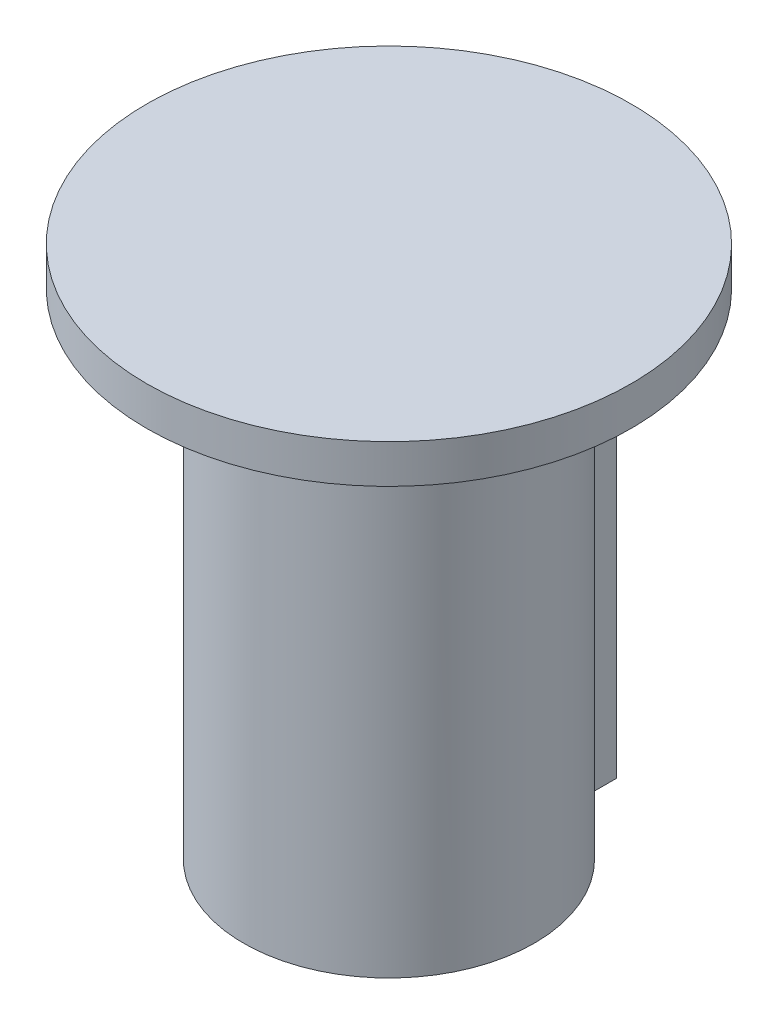
ISO-10303-21;
HEADER;
FILE_DESCRIPTION(('STEP AP214'),'2;1');
FILE_NAME('part.step','',(''),(''),'','','');
FILE_SCHEMA(('AUTOMOTIVE_DESIGN { 1 0 10303 214 1 1 1 1 }'));
ENDSEC;
DATA;
#1=APPLICATION_CONTEXT('core data for automotive mechanical design processes');
#2=APPLICATION_PROTOCOL_DEFINITION('international standard','automotive_design',2000,#1);
#3=PRODUCT_CONTEXT('',#1,'mechanical');
#4=PRODUCT('Part','Part','',(#3));
#5=PRODUCT_RELATED_PRODUCT_CATEGORY('part','',(#4));
#6=PRODUCT_DEFINITION_FORMATION('','',#4);
#7=PRODUCT_DEFINITION_CONTEXT('part definition',#1,'design');
#8=PRODUCT_DEFINITION('design','',#6,#7);
#9=PRODUCT_DEFINITION_SHAPE('','',#8);
#10=(LENGTH_UNIT() NAMED_UNIT(*) SI_UNIT(.MILLI.,.METRE.));
#11=(NAMED_UNIT(*) PLANE_ANGLE_UNIT() SI_UNIT($,.RADIAN.));
#12=(NAMED_UNIT(*) SI_UNIT($,.STERADIAN.) SOLID_ANGLE_UNIT());
#13=UNCERTAINTY_MEASURE_WITH_UNIT(LENGTH_MEASURE(1.E-05),#10,'distance_accuracy_value','');
#14=(GEOMETRIC_REPRESENTATION_CONTEXT(3) GLOBAL_UNCERTAINTY_ASSIGNED_CONTEXT((#13)) GLOBAL_UNIT_ASSIGNED_CONTEXT((#10,
#11,#12)) REPRESENTATION_CONTEXT('',''));
#15=CARTESIAN_POINT('',(0.,0.,0.));
#16=DIRECTION('',(0.,0.,1.));
#17=DIRECTION('',(1.,0.,0.));
#18=AXIS2_PLACEMENT_3D('',#15,#16,#17);
#19=CARTESIAN_POINT('',(0.,11.,0.));
#20=DIRECTION('',(0.,-1.,0.));
#21=DIRECTION('',(0.,0.,-1.));
#22=AXIS2_PLACEMENT_3D('',#19,#20,#21);
#23=CYLINDRICAL_SURFACE('',#22,3.);
#24=CARTESIAN_POINT('',(0.,0.,0.));
#25=DIRECTION('',(0.,1.,0.));
#26=DIRECTION('',(0.,0.,1.));
#27=AXIS2_PLACEMENT_3D('',#24,#25,#26);
#28=CIRCLE('',#27,3.);
#29=CARTESIAN_POINT('',(-0.9,0.,-2.86181760425084));
#30=VERTEX_POINT('',#29);
#31=CARTESIAN_POINT('',(0.9,0.,-2.86181760425084));
#32=VERTEX_POINT('',#31);
#33=EDGE_CURVE('E42',#30,#32,#28,.T.);
#34=ORIENTED_EDGE('',*,*,#33,.T.);
#35=DIRECTION('',(0.,-1.,0.));
#36=VECTOR('',#35,1.);
#37=CARTESIAN_POINT('',(0.9,6.6,-2.86181760425084));
#38=LINE('',#37,#36);
#39=CARTESIAN_POINT('',(0.9,6.6,-2.86181760425084));
#40=VERTEX_POINT('',#39);
#41=EDGE_CURVE('E54',#40,#32,#38,.T.);
#42=ORIENTED_EDGE('',*,*,#41,.F.);
#43=CARTESIAN_POINT('',(0.,6.6,0.));
#44=DIRECTION('',(0.,1.,0.));
#45=DIRECTION('',(0.,0.,1.));
#46=AXIS2_PLACEMENT_3D('',#43,#44,#45);
#47=CIRCLE('',#46,3.);
#48=CARTESIAN_POINT('',(-0.9,6.6,-2.86181760425084));
#49=VERTEX_POINT('',#48);
#50=EDGE_CURVE('E49',#40,#49,#47,.T.);
#51=ORIENTED_EDGE('',*,*,#50,.T.);
#52=DIRECTION('',(0.,-1.,0.));
#53=VECTOR('',#52,1.);
#54=CARTESIAN_POINT('',(-0.9,6.6,-2.86181760425084));
#55=LINE('',#54,#53);
#56=EDGE_CURVE('E96',#49,#30,#55,.T.);
#57=ORIENTED_EDGE('',*,*,#56,.T.);
#58=EDGE_LOOP('',(#34,#42,#51,#57));
#59=FACE_BOUND('',#58,.T.);
#60=CARTESIAN_POINT('',(0.,10.2,0.));
#61=DIRECTION('',(0.,1.,0.));
#62=DIRECTION('',(0.,0.,1.));
#63=AXIS2_PLACEMENT_3D('',#60,#61,#62);
#64=CIRCLE('',#63,3.);
#65=CARTESIAN_POINT('',(0.,10.2,3.));
#66=VERTEX_POINT('',#65);
#67=EDGE_CURVE('E11',#66,#66,#64,.T.);
#68=ORIENTED_EDGE('',*,*,#67,.F.);
#69=EDGE_LOOP('',(#68));
#70=FACE_BOUND('',#69,.T.);
#71=ADVANCED_FACE('F35',(#59,#70),#23,.T.);
#72=CARTESIAN_POINT('',(0.,0.,0.));
#73=DIRECTION('',(0.,1.,0.));
#74=DIRECTION('',(0.,0.,1.));
#75=AXIS2_PLACEMENT_3D('',#72,#73,#74);
#76=PLANE('',#75);
#77=ORIENTED_EDGE('',*,*,#33,.F.);
#78=DIRECTION('',(0.,0.,-1.));
#79=VECTOR('',#78,1.);
#80=CARTESIAN_POINT('',(-0.9,0.,0.));
#81=LINE('',#80,#79);
#82=CARTESIAN_POINT('',(-0.9,0.,-3.8));
#83=VERTEX_POINT('',#82);
#84=EDGE_CURVE('E104',#30,#83,#81,.T.);
#85=ORIENTED_EDGE('',*,*,#84,.T.);
#86=DIRECTION('',(1.,0.,0.));
#87=VECTOR('',#86,1.);
#88=CARTESIAN_POINT('',(0.,0.,-3.8));
#89=LINE('',#88,#87);
#90=CARTESIAN_POINT('',(0.899999999999999,0.,-3.8));
#91=VERTEX_POINT('',#90);
#92=EDGE_CURVE('E101',#83,#91,#89,.T.);
#93=ORIENTED_EDGE('',*,*,#92,.T.);
#94=DIRECTION('',(0.,0.,1.));
#95=VECTOR('',#94,1.);
#96=CARTESIAN_POINT('',(0.900000000000001,0.,0.));
#97=LINE('',#96,#95);
#98=EDGE_CURVE('E79',#91,#32,#97,.T.);
#99=ORIENTED_EDGE('',*,*,#98,.T.);
#100=EDGE_LOOP('',(#77,#85,#93,#99));
#101=FACE_BOUND('',#100,.T.);
#102=ADVANCED_FACE('F112',(#101),#76,.F.);
#103=CARTESIAN_POINT('',(0.900000000000001,6.6,0.));
#104=DIRECTION('',(1.,0.,0.));
#105=DIRECTION('',(0.,0.,-1.));
#106=AXIS2_PLACEMENT_3D('',#103,#104,#105);
#107=PLANE('',#106);
#108=ORIENTED_EDGE('',*,*,#98,.F.);
#109=DIRECTION('',(0.,-1.,0.));
#110=VECTOR('',#109,1.);
#111=CARTESIAN_POINT('',(0.899999999999999,6.6,-3.8));
#112=LINE('',#111,#110);
#113=CARTESIAN_POINT('',(0.899999999999999,6.6,-3.8));
#114=VERTEX_POINT('',#113);
#115=EDGE_CURVE('E74',#114,#91,#112,.T.);
#116=ORIENTED_EDGE('',*,*,#115,.F.);
#117=DIRECTION('',(0.,0.,1.));
#118=VECTOR('',#117,1.);
#119=CARTESIAN_POINT('',(0.900000000000001,6.6,0.));
#120=LINE('',#119,#118);
#121=EDGE_CURVE('E77',#114,#40,#120,.T.);
#122=ORIENTED_EDGE('',*,*,#121,.T.);
#123=ORIENTED_EDGE('',*,*,#41,.T.);
#124=EDGE_LOOP('',(#108,#116,#122,#123));
#125=FACE_BOUND('',#124,.T.);
#126=ADVANCED_FACE('F76',(#125),#107,.T.);
#127=CARTESIAN_POINT('',(0.,6.6,-3.8));
#128=DIRECTION('',(0.,0.,-1.));
#129=DIRECTION('',(-1.,0.,0.));
#130=AXIS2_PLACEMENT_3D('',#127,#128,#129);
#131=PLANE('',#130);
#132=ORIENTED_EDGE('',*,*,#92,.F.);
#133=DIRECTION('',(0.,-1.,0.));
#134=VECTOR('',#133,1.);
#135=CARTESIAN_POINT('',(-0.9,6.6,-3.8));
#136=LINE('',#135,#134);
#137=CARTESIAN_POINT('',(-0.9,6.6,-3.8));
#138=VERTEX_POINT('',#137);
#139=EDGE_CURVE('E84',#138,#83,#136,.T.);
#140=ORIENTED_EDGE('',*,*,#139,.F.);
#141=DIRECTION('',(1.,0.,0.));
#142=VECTOR('',#141,1.);
#143=CARTESIAN_POINT('',(0.,6.6,-3.8));
#144=LINE('',#143,#142);
#145=EDGE_CURVE('E90',#138,#114,#144,.T.);
#146=ORIENTED_EDGE('',*,*,#145,.T.);
#147=ORIENTED_EDGE('',*,*,#115,.T.);
#148=EDGE_LOOP('',(#132,#140,#146,#147));
#149=FACE_BOUND('',#148,.T.);
#150=ADVANCED_FACE('F93',(#149),#131,.T.);
#151=CARTESIAN_POINT('',(-0.9,6.6,0.));
#152=DIRECTION('',(-1.,0.,0.));
#153=DIRECTION('',(0.,0.,1.));
#154=AXIS2_PLACEMENT_3D('',#151,#152,#153);
#155=PLANE('',#154);
#156=ORIENTED_EDGE('',*,*,#84,.F.);
#157=ORIENTED_EDGE('',*,*,#56,.F.);
#158=DIRECTION('',(0.,0.,-1.));
#159=VECTOR('',#158,1.);
#160=CARTESIAN_POINT('',(-0.9,6.6,0.));
#161=LINE('',#160,#159);
#162=EDGE_CURVE('E94',#49,#138,#161,.T.);
#163=ORIENTED_EDGE('',*,*,#162,.T.);
#164=ORIENTED_EDGE('',*,*,#139,.T.);
#165=EDGE_LOOP('',(#156,#157,#163,#164));
#166=FACE_BOUND('',#165,.T.);
#167=ADVANCED_FACE('F114',(#166),#155,.T.);
#168=CARTESIAN_POINT('',(0.,6.6,0.));
#169=DIRECTION('',(0.,1.,0.));
#170=DIRECTION('',(0.,0.,1.));
#171=AXIS2_PLACEMENT_3D('',#168,#169,#170);
#172=PLANE('',#171);
#173=ORIENTED_EDGE('',*,*,#50,.F.);
#174=ORIENTED_EDGE('',*,*,#121,.F.);
#175=ORIENTED_EDGE('',*,*,#145,.F.);
#176=ORIENTED_EDGE('',*,*,#162,.F.);
#177=EDGE_LOOP('',(#173,#174,#175,#176));
#178=FACE_BOUND('',#177,.T.);
#179=ADVANCED_FACE('F88',(#178),#172,.T.);
#180=CARTESIAN_POINT('',(0.,10.2,0.));
#181=DIRECTION('',(0.,1.,0.));
#182=DIRECTION('',(0.,0.,1.));
#183=AXIS2_PLACEMENT_3D('',#180,#181,#182);
#184=CYLINDRICAL_SURFACE('',#183,5.);
#185=CARTESIAN_POINT('',(0.,10.2,0.));
#186=DIRECTION('',(0.,1.,0.));
#187=DIRECTION('',(0.,0.,1.));
#188=AXIS2_PLACEMENT_3D('',#185,#186,#187);
#189=CIRCLE('',#188,5.);
#190=CARTESIAN_POINT('',(0.,10.2,5.));
#191=VERTEX_POINT('',#190);
#192=EDGE_CURVE('E102',#191,#191,#189,.T.);
#193=ORIENTED_EDGE('',*,*,#192,.T.);
#194=EDGE_LOOP('',(#193));
#195=FACE_BOUND('',#194,.T.);
#196=CARTESIAN_POINT('',(0.,11.,0.));
#197=DIRECTION('',(0.,1.,0.));
#198=DIRECTION('',(0.,0.,1.));
#199=AXIS2_PLACEMENT_3D('',#196,#197,#198);
#200=CIRCLE('',#199,5.);
#201=CARTESIAN_POINT('',(0.,11.,5.));
#202=VERTEX_POINT('',#201);
#203=EDGE_CURVE('E144',#202,#202,#200,.T.);
#204=ORIENTED_EDGE('',*,*,#203,.F.);
#205=EDGE_LOOP('',(#204));
#206=FACE_BOUND('',#205,.T.);
#207=ADVANCED_FACE('F121',(#195,#206),#184,.T.);
#208=CARTESIAN_POINT('',(0.,10.2,0.));
#209=DIRECTION('',(0.,1.,0.));
#210=DIRECTION('',(0.,0.,1.));
#211=AXIS2_PLACEMENT_3D('',#208,#209,#210);
#212=PLANE('',#211);
#213=ORIENTED_EDGE('',*,*,#67,.T.);
#214=EDGE_LOOP('',(#213));
#215=FACE_BOUND('',#214,.T.);
#216=ORIENTED_EDGE('',*,*,#192,.F.);
#217=EDGE_LOOP('',(#216));
#218=FACE_BOUND('',#217,.T.);
#219=ADVANCED_FACE('F135',(#215,#218),#212,.F.);
#220=CARTESIAN_POINT('',(0.,11.,0.));
#221=DIRECTION('',(0.,1.,0.));
#222=DIRECTION('',(0.,0.,1.));
#223=AXIS2_PLACEMENT_3D('',#220,#221,#222);
#224=PLANE('',#223);
#225=ORIENTED_EDGE('',*,*,#203,.T.);
#226=EDGE_LOOP('',(#225));
#227=FACE_BOUND('',#226,.T.);
#228=ADVANCED_FACE('F133',(#227),#224,.T.);
#229=CLOSED_SHELL('',(#71,#102,#126,#150,#167,#179,#207,#219,#228));
#230=MANIFOLD_SOLID_BREP('B2',#229);
#231=ADVANCED_BREP_SHAPE_REPRESENTATION('',(#18,#230),#14);
#232=SHAPE_DEFINITION_REPRESENTATION(#9,#231);
ENDSEC;
END-ISO-10303-21;
